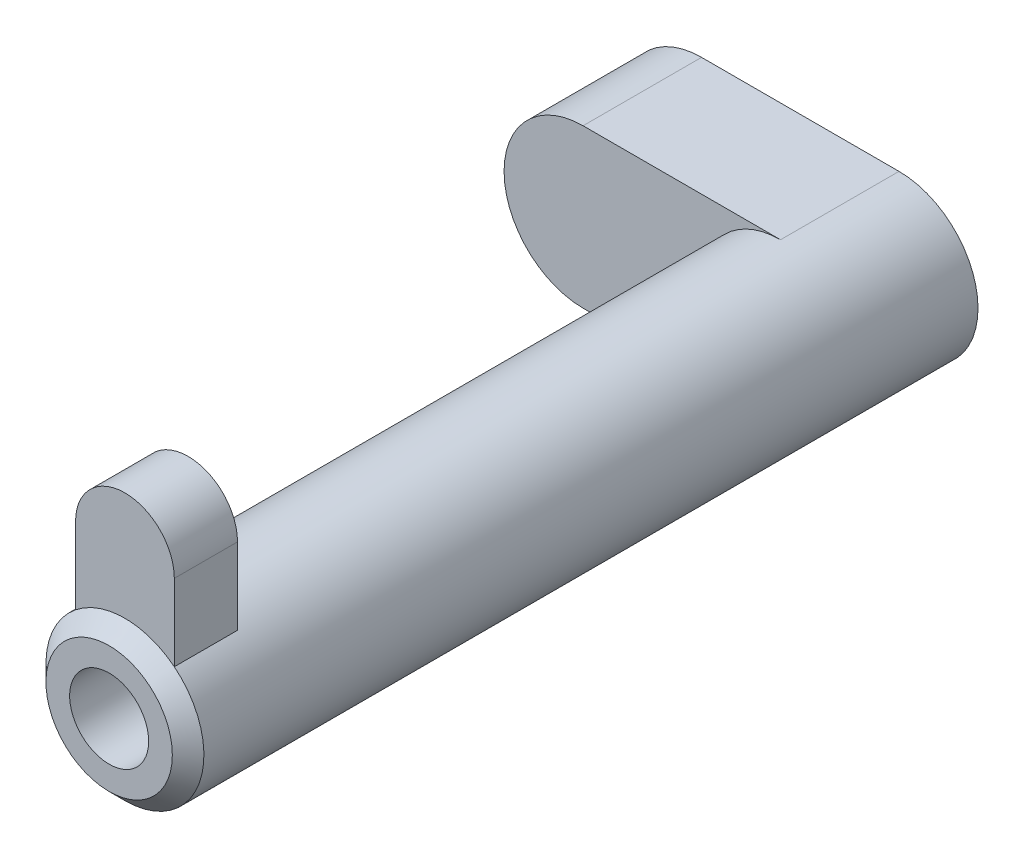
ISO-10303-21;
HEADER;
FILE_DESCRIPTION(('STEP AP214'),'2;1');
FILE_NAME('part.step','',(''),(''),'','','');
FILE_SCHEMA(('AUTOMOTIVE_DESIGN { 1 0 10303 214 1 1 1 1 }'));
ENDSEC;
DATA;
#1=APPLICATION_CONTEXT('core data for automotive mechanical design processes');
#2=APPLICATION_PROTOCOL_DEFINITION('international standard','automotive_design',2000,#1);
#3=PRODUCT_CONTEXT('',#1,'mechanical');
#4=PRODUCT('Part','Part','',(#3));
#5=PRODUCT_RELATED_PRODUCT_CATEGORY('part','',(#4));
#6=PRODUCT_DEFINITION_FORMATION('','',#4);
#7=PRODUCT_DEFINITION_CONTEXT('part definition',#1,'design');
#8=PRODUCT_DEFINITION('design','',#6,#7);
#9=PRODUCT_DEFINITION_SHAPE('','',#8);
#10=(LENGTH_UNIT() NAMED_UNIT(*) SI_UNIT(.MILLI.,.METRE.));
#11=(NAMED_UNIT(*) PLANE_ANGLE_UNIT() SI_UNIT($,.RADIAN.));
#12=(NAMED_UNIT(*) SI_UNIT($,.STERADIAN.) SOLID_ANGLE_UNIT());
#13=UNCERTAINTY_MEASURE_WITH_UNIT(LENGTH_MEASURE(1.E-05),#10,'distance_accuracy_value','');
#14=(GEOMETRIC_REPRESENTATION_CONTEXT(3) GLOBAL_UNCERTAINTY_ASSIGNED_CONTEXT((#13)) GLOBAL_UNIT_ASSIGNED_CONTEXT((#10,
#11,#12)) REPRESENTATION_CONTEXT('',''));
#15=CARTESIAN_POINT('',(0.,0.,0.));
#16=DIRECTION('',(0.,0.,1.));
#17=DIRECTION('',(1.,0.,0.));
#18=AXIS2_PLACEMENT_3D('',#15,#16,#17);
#19=CARTESIAN_POINT('',(-5.,0.,3.));
#20=DIRECTION('',(0.,0.,-1.));
#21=DIRECTION('',(-1.,0.,0.));
#22=AXIS2_PLACEMENT_3D('',#19,#20,#21);
#23=CYLINDRICAL_SURFACE('',#22,2.);
#24=CARTESIAN_POINT('',(-5.,0.,0.));
#25=DIRECTION('',(0.,0.,1.));
#26=DIRECTION('',(1.,0.,0.));
#27=AXIS2_PLACEMENT_3D('',#24,#25,#26);
#28=CIRCLE('',#27,2.);
#29=CARTESIAN_POINT('',(-5.,2.,0.));
#30=VERTEX_POINT('',#29);
#31=CARTESIAN_POINT('',(-5.,-2.,0.));
#32=VERTEX_POINT('',#31);
#33=EDGE_CURVE('E143',#30,#32,#28,.T.);
#34=ORIENTED_EDGE('',*,*,#33,.T.);
#35=DIRECTION('',(0.,0.,-1.));
#36=VECTOR('',#35,1.);
#37=CARTESIAN_POINT('',(-5.,-2.,3.));
#38=LINE('',#37,#36);
#39=CARTESIAN_POINT('',(-5.,-2.,3.));
#40=VERTEX_POINT('',#39);
#41=EDGE_CURVE('E168',#40,#32,#38,.T.);
#42=ORIENTED_EDGE('',*,*,#41,.F.);
#43=CARTESIAN_POINT('',(-5.,0.,3.));
#44=DIRECTION('',(0.,0.,1.));
#45=DIRECTION('',(1.,0.,0.));
#46=AXIS2_PLACEMENT_3D('',#43,#44,#45);
#47=CIRCLE('',#46,2.);
#48=CARTESIAN_POINT('',(-5.,2.,3.));
#49=VERTEX_POINT('',#48);
#50=EDGE_CURVE('E149',#49,#40,#47,.T.);
#51=ORIENTED_EDGE('',*,*,#50,.F.);
#52=DIRECTION('',(0.,0.,-1.));
#53=VECTOR('',#52,1.);
#54=CARTESIAN_POINT('',(-5.,2.,3.));
#55=LINE('',#54,#53);
#56=EDGE_CURVE('E153',#49,#30,#55,.T.);
#57=ORIENTED_EDGE('',*,*,#56,.T.);
#58=EDGE_LOOP('',(#34,#42,#51,#57));
#59=FACE_BOUND('',#58,.T.);
#60=ADVANCED_FACE('F37',(#59),#23,.T.);
#61=CARTESIAN_POINT('',(-5.,-2.,3.));
#62=DIRECTION('',(0.,1.,0.));
#63=DIRECTION('',(0.,0.,1.));
#64=AXIS2_PLACEMENT_3D('',#61,#62,#63);
#65=PLANE('',#64);
#66=DIRECTION('',(1.,0.,0.));
#67=VECTOR('',#66,1.);
#68=CARTESIAN_POINT('',(-5.,-2.,0.));
#69=LINE('',#68,#67);
#70=CARTESIAN_POINT('',(0.,-2.,0.));
#71=VERTEX_POINT('',#70);
#72=EDGE_CURVE('E156',#32,#71,#69,.T.);
#73=ORIENTED_EDGE('',*,*,#72,.T.);
#74=DIRECTION('',(0.,0.,-1.));
#75=VECTOR('',#74,1.);
#76=CARTESIAN_POINT('',(0.,-2.,3.));
#77=LINE('',#76,#75);
#78=CARTESIAN_POINT('',(0.,-2.,3.));
#79=VERTEX_POINT('',#78);
#80=EDGE_CURVE('E166',#79,#71,#77,.T.);
#81=ORIENTED_EDGE('',*,*,#80,.F.);
#82=DIRECTION('',(1.,0.,0.));
#83=VECTOR('',#82,1.);
#84=CARTESIAN_POINT('',(-5.,-2.,3.));
#85=LINE('',#84,#83);
#86=EDGE_CURVE('E89',#40,#79,#85,.T.);
#87=ORIENTED_EDGE('',*,*,#86,.F.);
#88=ORIENTED_EDGE('',*,*,#41,.T.);
#89=EDGE_LOOP('',(#73,#81,#87,#88));
#90=FACE_BOUND('',#89,.T.);
#91=ADVANCED_FACE('F183',(#90),#65,.F.);
#92=CARTESIAN_POINT('',(0.,0.,3.));
#93=DIRECTION('',(0.,0.,-1.));
#94=DIRECTION('',(-1.,0.,0.));
#95=AXIS2_PLACEMENT_3D('',#92,#93,#94);
#96=CYLINDRICAL_SURFACE('',#95,2.);
#97=DIRECTION('',(0.,0.,-1.));
#98=VECTOR('',#97,1.);
#99=CARTESIAN_POINT('',(1.25,1.5612494995996,19.6));
#100=LINE('',#99,#98);
#101=CARTESIAN_POINT('',(1.25,1.5612494995996,19.6));
#102=VERTEX_POINT('',#101);
#103=CARTESIAN_POINT('',(1.25,1.5612494995996,18.));
#104=VERTEX_POINT('',#103);
#105=EDGE_CURVE('E124',#102,#104,#100,.T.);
#106=ORIENTED_EDGE('',*,*,#105,.F.);
#107=CARTESIAN_POINT('',(0.,0.,19.6));
#108=DIRECTION('',(0.,0.,1.));
#109=DIRECTION('',(1.,0.,0.));
#110=AXIS2_PLACEMENT_3D('',#107,#108,#109);
#111=CIRCLE('',#110,2.);
#112=CARTESIAN_POINT('',(-1.25,1.5612494995996,19.6));
#113=VERTEX_POINT('',#112);
#114=EDGE_CURVE('E11',#102,#113,#111,.F.);
#115=ORIENTED_EDGE('',*,*,#114,.T.);
#116=DIRECTION('',(0.,0.,-1.));
#117=VECTOR('',#116,1.);
#118=CARTESIAN_POINT('',(-1.25,1.5612494995996,19.6));
#119=LINE('',#118,#117);
#120=CARTESIAN_POINT('',(-1.25,1.5612494995996,18.));
#121=VERTEX_POINT('',#120);
#122=EDGE_CURVE('E316',#113,#121,#119,.T.);
#123=ORIENTED_EDGE('',*,*,#122,.T.);
#124=CARTESIAN_POINT('',(0.,0.,18.));
#125=DIRECTION('',(0.,0.,1.));
#126=DIRECTION('',(1.,0.,0.));
#127=AXIS2_PLACEMENT_3D('',#124,#125,#126);
#128=CIRCLE('',#127,2.);
#129=EDGE_CURVE('E140',#104,#121,#128,.T.);
#130=ORIENTED_EDGE('',*,*,#129,.F.);
#131=EDGE_LOOP('',(#106,#115,#123,#130));
#132=FACE_BOUND('',#131,.T.);
#133=CARTESIAN_POINT('',(0.,0.,0.));
#134=DIRECTION('',(0.,0.,-1.));
#135=DIRECTION('',(-1.,0.,0.));
#136=AXIS2_PLACEMENT_3D('',#133,#134,#135);
#137=CIRCLE('',#136,2.);
#138=CARTESIAN_POINT('',(0.,2.,0.));
#139=VERTEX_POINT('',#138);
#140=EDGE_CURVE('E159',#139,#71,#137,.T.);
#141=ORIENTED_EDGE('',*,*,#140,.F.);
#142=DIRECTION('',(0.,0.,-1.));
#143=VECTOR('',#142,1.);
#144=CARTESIAN_POINT('',(0.,2.,3.));
#145=LINE('',#144,#143);
#146=CARTESIAN_POINT('',(0.,2.,3.));
#147=VERTEX_POINT('',#146);
#148=EDGE_CURVE('E164',#147,#139,#145,.T.);
#149=ORIENTED_EDGE('',*,*,#148,.F.);
#150=CARTESIAN_POINT('',(0.,0.,3.));
#151=DIRECTION('',(0.,0.,1.));
#152=DIRECTION('',(1.,0.,0.));
#153=AXIS2_PLACEMENT_3D('',#150,#151,#152);
#154=CIRCLE('',#153,2.);
#155=EDGE_CURVE('E141',#147,#79,#154,.T.);
#156=ORIENTED_EDGE('',*,*,#155,.T.);
#157=ORIENTED_EDGE('',*,*,#80,.T.);
#158=EDGE_LOOP('',(#141,#149,#156,#157));
#159=FACE_BOUND('',#158,.T.);
#160=ADVANCED_FACE('F138',(#132,#159),#96,.T.);
#161=CARTESIAN_POINT('',(0.,2.,3.));
#162=DIRECTION('',(0.,-1.,0.));
#163=DIRECTION('',(1.,0.,0.));
#164=AXIS2_PLACEMENT_3D('',#161,#162,#163);
#165=PLANE('',#164);
#166=DIRECTION('',(-1.,0.,0.));
#167=VECTOR('',#166,1.);
#168=CARTESIAN_POINT('',(0.,2.,0.));
#169=LINE('',#168,#167);
#170=EDGE_CURVE('E82',#139,#30,#169,.T.);
#171=ORIENTED_EDGE('',*,*,#170,.T.);
#172=ORIENTED_EDGE('',*,*,#56,.F.);
#173=DIRECTION('',(-1.,0.,0.));
#174=VECTOR('',#173,1.);
#175=CARTESIAN_POINT('',(0.,2.,3.));
#176=LINE('',#175,#174);
#177=EDGE_CURVE('E62',#147,#49,#176,.T.);
#178=ORIENTED_EDGE('',*,*,#177,.F.);
#179=ORIENTED_EDGE('',*,*,#148,.T.);
#180=EDGE_LOOP('',(#171,#172,#178,#179));
#181=FACE_BOUND('',#180,.T.);
#182=ADVANCED_FACE('F192',(#181),#165,.F.);
#183=CARTESIAN_POINT('',(-5.,0.,3.));
#184=DIRECTION('',(0.,0.,1.));
#185=DIRECTION('',(1.,0.,0.));
#186=AXIS2_PLACEMENT_3D('',#183,#184,#185);
#187=PLANE('',#186);
#188=ORIENTED_EDGE('',*,*,#155,.F.);
#189=ORIENTED_EDGE('',*,*,#177,.T.);
#190=ORIENTED_EDGE('',*,*,#50,.T.);
#191=ORIENTED_EDGE('',*,*,#86,.T.);
#192=EDGE_LOOP('',(#188,#189,#190,#191));
#193=FACE_BOUND('',#192,.T.);
#194=ADVANCED_FACE('F195',(#193),#187,.T.);
#195=CARTESIAN_POINT('',(-5.,0.,0.));
#196=DIRECTION('',(0.,0.,1.));
#197=DIRECTION('',(1.,0.,0.));
#198=AXIS2_PLACEMENT_3D('',#195,#196,#197);
#199=PLANE('',#198);
#200=CARTESIAN_POINT('',(0.,0.,0.));
#201=DIRECTION('',(0.,0.,1.));
#202=DIRECTION('',(1.,0.,0.));
#203=AXIS2_PLACEMENT_3D('',#200,#201,#202);
#204=CIRCLE('',#203,1.);
#205=CARTESIAN_POINT('',(1.,0.,0.));
#206=VERTEX_POINT('',#205);
#207=EDGE_CURVE('E314',#206,#206,#204,.F.);
#208=ORIENTED_EDGE('',*,*,#207,.F.);
#209=EDGE_LOOP('',(#208));
#210=FACE_BOUND('',#209,.T.);
#211=ORIENTED_EDGE('',*,*,#33,.F.);
#212=ORIENTED_EDGE('',*,*,#170,.F.);
#213=ORIENTED_EDGE('',*,*,#140,.T.);
#214=ORIENTED_EDGE('',*,*,#72,.F.);
#215=EDGE_LOOP('',(#211,#212,#213,#214));
#216=FACE_BOUND('',#215,.T.);
#217=ADVANCED_FACE('F196',(#210,#216),#199,.F.);
#218=CARTESIAN_POINT('',(0.,0.,20.));
#219=DIRECTION('',(0.,0.,1.));
#220=DIRECTION('',(1.,0.,0.));
#221=AXIS2_PLACEMENT_3D('',#218,#219,#220);
#222=PLANE('',#221);
#223=CARTESIAN_POINT('',(0.,0.,20.));
#224=DIRECTION('',(0.,0.,1.));
#225=DIRECTION('',(1.,0.,0.));
#226=AXIS2_PLACEMENT_3D('',#223,#224,#225);
#227=CIRCLE('',#226,1.6);
#228=CARTESIAN_POINT('',(1.6,0.,20.));
#229=VERTEX_POINT('',#228);
#230=EDGE_CURVE('E46',#229,#229,#227,.T.);
#231=ORIENTED_EDGE('',*,*,#230,.T.);
#232=EDGE_LOOP('',(#231));
#233=FACE_BOUND('',#232,.T.);
#234=CARTESIAN_POINT('',(0.,0.,20.));
#235=DIRECTION('',(0.,0.,1.));
#236=DIRECTION('',(1.,0.,0.));
#237=AXIS2_PLACEMENT_3D('',#234,#235,#236);
#238=CIRCLE('',#237,1.);
#239=CARTESIAN_POINT('',(1.,0.,20.));
#240=VERTEX_POINT('',#239);
#241=EDGE_CURVE('E328',#240,#240,#238,.T.);
#242=ORIENTED_EDGE('',*,*,#241,.F.);
#243=EDGE_LOOP('',(#242));
#244=FACE_BOUND('',#243,.T.);
#245=ADVANCED_FACE('F172',(#233,#244),#222,.T.);
#246=CARTESIAN_POINT('',(1.25,0.,19.6));
#247=DIRECTION('',(-1.,0.,0.));
#248=DIRECTION('',(0.,-1.,0.));
#249=AXIS2_PLACEMENT_3D('',#246,#247,#248);
#250=PLANE('',#249);
#251=DIRECTION('',(0.,1.,0.));
#252=VECTOR('',#251,1.);
#253=CARTESIAN_POINT('',(1.25,0.,18.));
#254=LINE('',#253,#252);
#255=CARTESIAN_POINT('',(1.25,3.5,18.));
#256=VERTEX_POINT('',#255);
#257=EDGE_CURVE('E53',#104,#256,#254,.T.);
#258=ORIENTED_EDGE('',*,*,#257,.T.);
#259=DIRECTION('',(0.,0.,-1.));
#260=VECTOR('',#259,1.);
#261=CARTESIAN_POINT('',(1.25,3.5,19.6));
#262=LINE('',#261,#260);
#263=CARTESIAN_POINT('',(1.25,3.5,19.6));
#264=VERTEX_POINT('',#263);
#265=EDGE_CURVE('E126',#264,#256,#262,.T.);
#266=ORIENTED_EDGE('',*,*,#265,.F.);
#267=DIRECTION('',(0.,1.,0.));
#268=VECTOR('',#267,1.);
#269=CARTESIAN_POINT('',(1.25,0.,19.6));
#270=LINE('',#269,#268);
#271=EDGE_CURVE('E122',#102,#264,#270,.T.);
#272=ORIENTED_EDGE('',*,*,#271,.F.);
#273=ORIENTED_EDGE('',*,*,#105,.T.);
#274=EDGE_LOOP('',(#258,#266,#272,#273));
#275=FACE_BOUND('',#274,.T.);
#276=ADVANCED_FACE('F123',(#275),#250,.F.);
#277=CARTESIAN_POINT('',(0.,3.5,19.6));
#278=DIRECTION('',(0.,0.,-1.));
#279=DIRECTION('',(-1.,0.,0.));
#280=AXIS2_PLACEMENT_3D('',#277,#278,#279);
#281=CYLINDRICAL_SURFACE('',#280,1.25);
#282=CARTESIAN_POINT('',(0.,3.5,18.));
#283=DIRECTION('',(0.,0.,1.));
#284=DIRECTION('',(1.,0.,0.));
#285=AXIS2_PLACEMENT_3D('',#282,#283,#284);
#286=CIRCLE('',#285,1.25);
#287=CARTESIAN_POINT('',(-1.25,3.5,18.));
#288=VERTEX_POINT('',#287);
#289=EDGE_CURVE('E318',#288,#256,#286,.F.);
#290=ORIENTED_EDGE('',*,*,#289,.F.);
#291=DIRECTION('',(0.,0.,-1.));
#292=VECTOR('',#291,1.);
#293=CARTESIAN_POINT('',(-1.25,3.5,19.6));
#294=LINE('',#293,#292);
#295=CARTESIAN_POINT('',(-1.25,3.5,19.6));
#296=VERTEX_POINT('',#295);
#297=EDGE_CURVE('E145',#296,#288,#294,.T.);
#298=ORIENTED_EDGE('',*,*,#297,.F.);
#299=CARTESIAN_POINT('',(0.,3.5,19.6));
#300=DIRECTION('',(0.,0.,1.));
#301=DIRECTION('',(1.,0.,0.));
#302=AXIS2_PLACEMENT_3D('',#299,#300,#301);
#303=CIRCLE('',#302,1.25);
#304=EDGE_CURVE('E130',#296,#264,#303,.F.);
#305=ORIENTED_EDGE('',*,*,#304,.T.);
#306=ORIENTED_EDGE('',*,*,#265,.T.);
#307=EDGE_LOOP('',(#290,#298,#305,#306));
#308=FACE_BOUND('',#307,.T.);
#309=ADVANCED_FACE('F206',(#308),#281,.T.);
#310=CARTESIAN_POINT('',(-1.25,0.,19.6));
#311=DIRECTION('',(-1.,0.,0.));
#312=DIRECTION('',(0.,-1.,0.));
#313=AXIS2_PLACEMENT_3D('',#310,#311,#312);
#314=PLANE('',#313);
#315=DIRECTION('',(0.,1.,0.));
#316=VECTOR('',#315,1.);
#317=CARTESIAN_POINT('',(-1.25,0.,18.));
#318=LINE('',#317,#316);
#319=EDGE_CURVE('E136',#121,#288,#318,.T.);
#320=ORIENTED_EDGE('',*,*,#319,.F.);
#321=ORIENTED_EDGE('',*,*,#122,.F.);
#322=DIRECTION('',(0.,1.,0.));
#323=VECTOR('',#322,1.);
#324=CARTESIAN_POINT('',(-1.25,0.,19.6));
#325=LINE('',#324,#323);
#326=EDGE_CURVE('E135',#113,#296,#325,.T.);
#327=ORIENTED_EDGE('',*,*,#326,.T.);
#328=ORIENTED_EDGE('',*,*,#297,.T.);
#329=EDGE_LOOP('',(#320,#321,#327,#328));
#330=FACE_BOUND('',#329,.T.);
#331=ADVANCED_FACE('F209',(#330),#314,.T.);
#332=CARTESIAN_POINT('',(0.,0.,19.6));
#333=DIRECTION('',(0.,0.,1.));
#334=DIRECTION('',(1.,0.,0.));
#335=AXIS2_PLACEMENT_3D('',#332,#333,#334);
#336=PLANE('',#335);
#337=CARTESIAN_POINT('',(0.,0.,19.6));
#338=DIRECTION('',(0.,0.,1.));
#339=DIRECTION('',(1.,0.,0.));
#340=AXIS2_PLACEMENT_3D('',#337,#338,#339);
#341=CIRCLE('',#340,2.);
#342=EDGE_CURVE('E115',#102,#113,#341,.T.);
#343=ORIENTED_EDGE('',*,*,#342,.F.);
#344=ORIENTED_EDGE('',*,*,#271,.T.);
#345=ORIENTED_EDGE('',*,*,#304,.F.);
#346=ORIENTED_EDGE('',*,*,#326,.F.);
#347=EDGE_LOOP('',(#343,#344,#345,#346));
#348=FACE_BOUND('',#347,.T.);
#349=ADVANCED_FACE('F133',(#348),#336,.T.);
#350=CARTESIAN_POINT('',(0.,0.,18.));
#351=DIRECTION('',(0.,0.,1.));
#352=DIRECTION('',(1.,0.,0.));
#353=AXIS2_PLACEMENT_3D('',#350,#351,#352);
#354=PLANE('',#353);
#355=ORIENTED_EDGE('',*,*,#129,.T.);
#356=ORIENTED_EDGE('',*,*,#319,.T.);
#357=ORIENTED_EDGE('',*,*,#289,.T.);
#358=ORIENTED_EDGE('',*,*,#257,.F.);
#359=EDGE_LOOP('',(#355,#356,#357,#358));
#360=FACE_BOUND('',#359,.T.);
#361=ADVANCED_FACE('F179',(#360),#354,.F.);
#362=CARTESIAN_POINT('',(0.,0.,-0.001000000000001));
#363=DIRECTION('',(0.,0.,1.));
#364=DIRECTION('',(1.,0.,0.));
#365=AXIS2_PLACEMENT_3D('',#362,#363,#364);
#366=CYLINDRICAL_SURFACE('',#365,1.);
#367=ORIENTED_EDGE('',*,*,#241,.T.);
#368=EDGE_LOOP('',(#367));
#369=FACE_BOUND('',#368,.T.);
#370=ORIENTED_EDGE('',*,*,#207,.T.);
#371=EDGE_LOOP('',(#370));
#372=FACE_BOUND('',#371,.T.);
#373=ADVANCED_FACE('F175',(#369,#372),#366,.F.);
#374=CARTESIAN_POINT('',(0.,0.,20.));
#375=DIRECTION('',(0.,0.,-1.));
#376=DIRECTION('',(-1.,0.,0.));
#377=AXIS2_PLACEMENT_3D('',#374,#375,#376);
#378=CONICAL_SURFACE('',#377,1.6,0.785398163397445);
#379=ORIENTED_EDGE('',*,*,#114,.F.);
#380=ORIENTED_EDGE('',*,*,#342,.T.);
#381=EDGE_LOOP('',(#379,#380));
#382=FACE_BOUND('',#381,.T.);
#383=ORIENTED_EDGE('',*,*,#230,.F.);
#384=EDGE_LOOP('',(#383));
#385=FACE_BOUND('',#384,.T.);
#386=ADVANCED_FACE('F40',(#382,#385),#378,.T.);
#387=CLOSED_SHELL('',(#60,#91,#160,#182,#194,#217,#245,#276,#309,#331,#349,#361,#373,#386));
#388=MANIFOLD_SOLID_BREP('B2',#387);
#389=ADVANCED_BREP_SHAPE_REPRESENTATION('',(#18,#388),#14);
#390=SHAPE_DEFINITION_REPRESENTATION(#9,#389);
ENDSEC;
END-ISO-10303-21;
